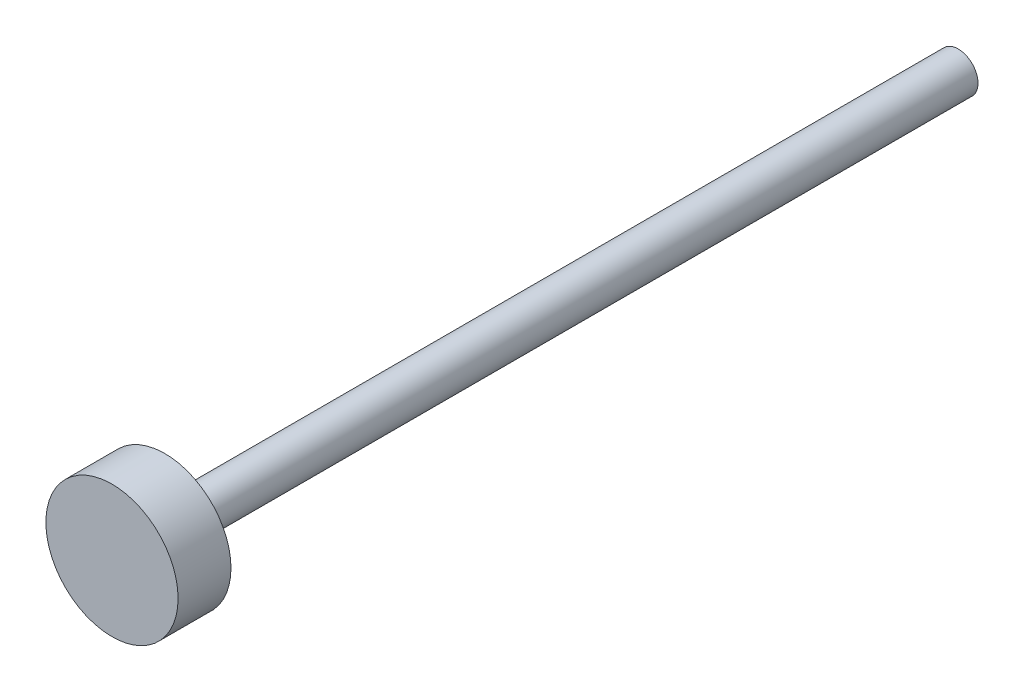
ISO-10303-21;
HEADER;
FILE_DESCRIPTION(('STEP AP214'),'2;1');
FILE_NAME('part.step','',(''),(''),'','','');
FILE_SCHEMA(('AUTOMOTIVE_DESIGN { 1 0 10303 214 1 1 1 1 }'));
ENDSEC;
DATA;
#1=APPLICATION_CONTEXT('core data for automotive mechanical design processes');
#2=APPLICATION_PROTOCOL_DEFINITION('international standard','automotive_design',2000,#1);
#3=PRODUCT_CONTEXT('',#1,'mechanical');
#4=PRODUCT('Part','Part','',(#3));
#5=PRODUCT_RELATED_PRODUCT_CATEGORY('part','',(#4));
#6=PRODUCT_DEFINITION_FORMATION('','',#4);
#7=PRODUCT_DEFINITION_CONTEXT('part definition',#1,'design');
#8=PRODUCT_DEFINITION('design','',#6,#7);
#9=PRODUCT_DEFINITION_SHAPE('','',#8);
#10=(LENGTH_UNIT() NAMED_UNIT(*) SI_UNIT(.MILLI.,.METRE.));
#11=(NAMED_UNIT(*) PLANE_ANGLE_UNIT() SI_UNIT($,.RADIAN.));
#12=(NAMED_UNIT(*) SI_UNIT($,.STERADIAN.) SOLID_ANGLE_UNIT());
#13=UNCERTAINTY_MEASURE_WITH_UNIT(LENGTH_MEASURE(1.E-05),#10,'distance_accuracy_value','');
#14=(GEOMETRIC_REPRESENTATION_CONTEXT(3) GLOBAL_UNCERTAINTY_ASSIGNED_CONTEXT((#13)) GLOBAL_UNIT_ASSIGNED_CONTEXT((#10,
#11,#12)) REPRESENTATION_CONTEXT('',''));
#15=CARTESIAN_POINT('',(0.,0.,0.));
#16=DIRECTION('',(0.,0.,1.));
#17=DIRECTION('',(1.,0.,0.));
#18=AXIS2_PLACEMENT_3D('',#15,#16,#17);
#19=CARTESIAN_POINT('',(0.,0.,30.));
#20=DIRECTION('',(0.,0.,-1.));
#21=DIRECTION('',(-1.,0.,0.));
#22=AXIS2_PLACEMENT_3D('',#19,#20,#21);
#23=CYLINDRICAL_SURFACE('',#22,0.75);
#24=CARTESIAN_POINT('',(0.,0.,30.));
#25=DIRECTION('',(0.,0.,1.));
#26=DIRECTION('',(1.,0.,0.));
#27=AXIS2_PLACEMENT_3D('',#24,#25,#26);
#28=CIRCLE('',#27,0.75);
#29=CARTESIAN_POINT('',(0.75,0.,30.));
#30=VERTEX_POINT('',#29);
#31=EDGE_CURVE('E10',#30,#30,#28,.T.);
#32=ORIENTED_EDGE('',*,*,#31,.F.);
#33=EDGE_LOOP('',(#32));
#34=FACE_BOUND('',#33,.T.);
#35=CARTESIAN_POINT('',(0.,0.,0.));
#36=DIRECTION('',(0.,0.,1.));
#37=DIRECTION('',(1.,0.,0.));
#38=AXIS2_PLACEMENT_3D('',#35,#36,#37);
#39=CIRCLE('',#38,0.75);
#40=CARTESIAN_POINT('',(0.75,0.,0.));
#41=VERTEX_POINT('',#40);
#42=EDGE_CURVE('E46',#41,#41,#39,.T.);
#43=ORIENTED_EDGE('',*,*,#42,.T.);
#44=EDGE_LOOP('',(#43));
#45=FACE_BOUND('',#44,.T.);
#46=ADVANCED_FACE('F43',(#34,#45),#23,.T.);
#47=CARTESIAN_POINT('',(0.,0.,0.));
#48=DIRECTION('',(0.,0.,1.));
#49=DIRECTION('',(1.,0.,0.));
#50=AXIS2_PLACEMENT_3D('',#47,#48,#49);
#51=PLANE('',#50);
#52=ORIENTED_EDGE('',*,*,#42,.F.);
#53=EDGE_LOOP('',(#52));
#54=FACE_BOUND('',#53,.T.);
#55=ADVANCED_FACE('F70',(#54),#51,.F.);
#56=CARTESIAN_POINT('',(0.,0.,32.));
#57=DIRECTION('',(0.,0.,-1.));
#58=DIRECTION('',(-1.,0.,0.));
#59=AXIS2_PLACEMENT_3D('',#56,#57,#58);
#60=CYLINDRICAL_SURFACE('',#59,2.5);
#61=CARTESIAN_POINT('',(0.,0.,32.));
#62=DIRECTION('',(0.,0.,1.));
#63=DIRECTION('',(1.,0.,0.));
#64=AXIS2_PLACEMENT_3D('',#61,#62,#63);
#65=CIRCLE('',#64,2.5);
#66=CARTESIAN_POINT('',(2.5,0.,32.));
#67=VERTEX_POINT('',#66);
#68=EDGE_CURVE('E55',#67,#67,#65,.T.);
#69=ORIENTED_EDGE('',*,*,#68,.F.);
#70=EDGE_LOOP('',(#69));
#71=FACE_BOUND('',#70,.T.);
#72=CARTESIAN_POINT('',(0.,0.,30.));
#73=DIRECTION('',(0.,0.,1.));
#74=DIRECTION('',(1.,0.,0.));
#75=AXIS2_PLACEMENT_3D('',#72,#73,#74);
#76=CIRCLE('',#75,2.5);
#77=CARTESIAN_POINT('',(2.5,0.,30.));
#78=VERTEX_POINT('',#77);
#79=EDGE_CURVE('E57',#78,#78,#76,.T.);
#80=ORIENTED_EDGE('',*,*,#79,.T.);
#81=EDGE_LOOP('',(#80));
#82=FACE_BOUND('',#81,.T.);
#83=ADVANCED_FACE('F67',(#71,#82),#60,.T.);
#84=CARTESIAN_POINT('',(0.,0.,32.));
#85=DIRECTION('',(0.,0.,1.));
#86=DIRECTION('',(1.,0.,0.));
#87=AXIS2_PLACEMENT_3D('',#84,#85,#86);
#88=PLANE('',#87);
#89=ORIENTED_EDGE('',*,*,#68,.T.);
#90=EDGE_LOOP('',(#89));
#91=FACE_BOUND('',#90,.T.);
#92=ADVANCED_FACE('F65',(#91),#88,.T.);
#93=CARTESIAN_POINT('',(0.,0.,30.));
#94=DIRECTION('',(0.,0.,1.));
#95=DIRECTION('',(1.,0.,0.));
#96=AXIS2_PLACEMENT_3D('',#93,#94,#95);
#97=PLANE('',#96);
#98=ORIENTED_EDGE('',*,*,#31,.T.);
#99=EDGE_LOOP('',(#98));
#100=FACE_BOUND('',#99,.T.);
#101=ORIENTED_EDGE('',*,*,#79,.F.);
#102=EDGE_LOOP('',(#101));
#103=FACE_BOUND('',#102,.T.);
#104=ADVANCED_FACE('F74',(#100,#103),#97,.F.);
#105=CLOSED_SHELL('',(#46,#55,#83,#92,#104));
#106=MANIFOLD_SOLID_BREP('B2',#105);
#107=ADVANCED_BREP_SHAPE_REPRESENTATION('',(#18,#106),#14);
#108=SHAPE_DEFINITION_REPRESENTATION(#9,#107);
ENDSEC;
END-ISO-10303-21;
